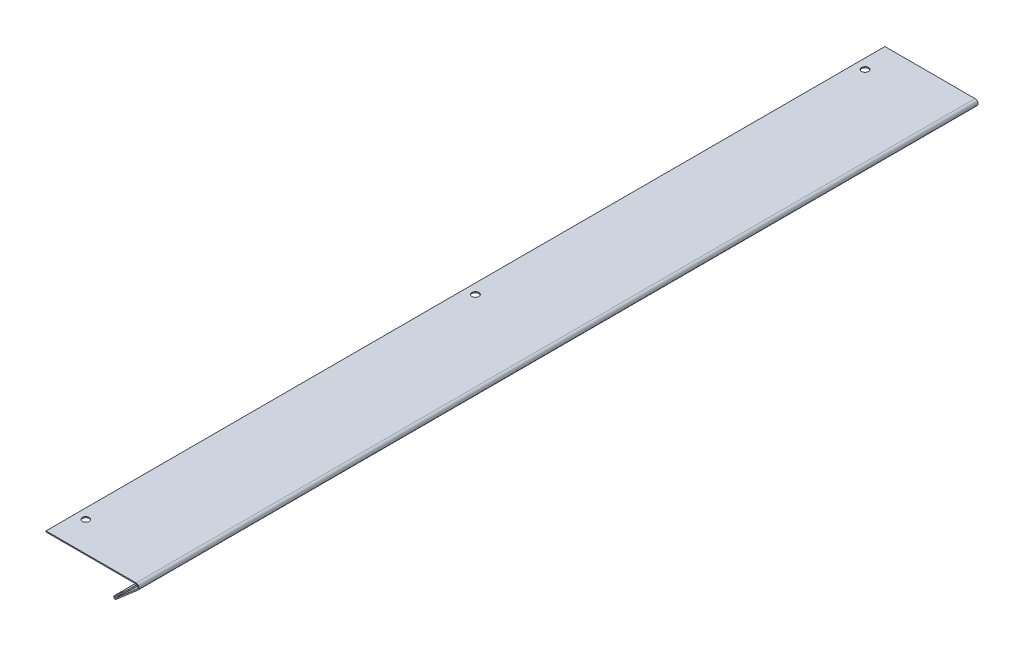
ISO-10303-21;
HEADER;
FILE_DESCRIPTION(('STEP AP214'),'2;1');
FILE_NAME('part.step','',(''),(''),'','','');
FILE_SCHEMA(('AUTOMOTIVE_DESIGN { 1 0 10303 214 1 1 1 1 }'));
ENDSEC;
DATA;
#1=APPLICATION_CONTEXT('core data for automotive mechanical design processes');
#2=APPLICATION_PROTOCOL_DEFINITION('international standard','automotive_design',2000,#1);
#3=PRODUCT_CONTEXT('',#1,'mechanical');
#4=PRODUCT('Part','Part','',(#3));
#5=PRODUCT_RELATED_PRODUCT_CATEGORY('part','',(#4));
#6=PRODUCT_DEFINITION_FORMATION('','',#4);
#7=PRODUCT_DEFINITION_CONTEXT('part definition',#1,'design');
#8=PRODUCT_DEFINITION('design','',#6,#7);
#9=PRODUCT_DEFINITION_SHAPE('','',#8);
#10=(LENGTH_UNIT() NAMED_UNIT(*) SI_UNIT(.MILLI.,.METRE.));
#11=(NAMED_UNIT(*) PLANE_ANGLE_UNIT() SI_UNIT($,.RADIAN.));
#12=(NAMED_UNIT(*) SI_UNIT($,.STERADIAN.) SOLID_ANGLE_UNIT());
#13=UNCERTAINTY_MEASURE_WITH_UNIT(LENGTH_MEASURE(1.E-05),#10,'distance_accuracy_value','');
#14=(GEOMETRIC_REPRESENTATION_CONTEXT(3) GLOBAL_UNCERTAINTY_ASSIGNED_CONTEXT((#13)) GLOBAL_UNIT_ASSIGNED_CONTEXT((#10,
#11,#12)) REPRESENTATION_CONTEXT('',''));
#15=CARTESIAN_POINT('',(0.,0.,0.));
#16=DIRECTION('',(0.,0.,1.));
#17=DIRECTION('',(1.,0.,0.));
#18=AXIS2_PLACEMENT_3D('',#15,#16,#17);
#19=CARTESIAN_POINT('',(48.3280295144953,-0.877354790111383,211.));
#20=DIRECTION('',(0.,0.,1.));
#21=DIRECTION('',(1.,0.,0.));
#22=AXIS2_PLACEMENT_3D('',#19,#20,#21);
#23=PLANE('',#22);
#24=DIRECTION('',(0.754709580222771,0.656059028990508,0.));
#25=VECTOR('',#24,1.);
#26=CARTESIAN_POINT('',(48.,-0.499999999999997,211.));
#27=LINE('',#26,#25);
#28=CARTESIAN_POINT('',(34.9812597411572,-11.8170182500863,211.));
#29=VERTEX_POINT('',#28);
#30=CARTESIAN_POINT('',(45.9814375350637,-2.25470958022269,211.));
#31=VERTEX_POINT('',#30);
#32=EDGE_CURVE('E139',#29,#31,#27,.T.);
#33=ORIENTED_EDGE('',*,*,#32,.F.);
#34=DIRECTION('',(0.656059028990517,-0.754709580222763,0.));
#35=VECTOR('',#34,1.);
#36=CARTESIAN_POINT('',(34.9812597411572,-11.8170182500863,211.));
#37=LINE('',#36,#35);
#38=CARTESIAN_POINT('',(35.3092892556525,-12.1943730401976,211.));
#39=VERTEX_POINT('',#38);
#40=EDGE_CURVE('E199',#29,#39,#37,.T.);
#41=ORIENTED_EDGE('',*,*,#40,.T.);
#42=DIRECTION('',(0.754709580222771,0.656059028990508,0.));
#43=VECTOR('',#42,1.);
#44=CARTESIAN_POINT('',(48.3280295144953,-0.877354790111383,211.));
#45=LINE('',#44,#43);
#46=CARTESIAN_POINT('',(46.3094670495589,-2.63206437033415,211.));
#47=VERTEX_POINT('',#46);
#48=EDGE_CURVE('E125',#39,#47,#45,.T.);
#49=ORIENTED_EDGE('',*,*,#48,.T.);
#50=DIRECTION('',(0.656059028990508,-0.754709580222771,0.));
#51=VECTOR('',#50,1.);
#52=CARTESIAN_POINT('',(45.9814375350637,-2.25470958022276,211.));
#53=LINE('',#52,#51);
#54=EDGE_CURVE('E153',#31,#47,#53,.T.);
#55=ORIENTED_EDGE('',*,*,#54,.F.);
#56=EDGE_LOOP('',(#33,#41,#49,#55));
#57=FACE_BOUND('',#56,.T.);
#58=ADVANCED_FACE('F36',(#57),#23,.T.);
#59=CARTESIAN_POINT('',(0.,-0.5,211.));
#60=DIRECTION('',(0.,1.,0.));
#61=DIRECTION('',(0.,0.,1.));
#62=AXIS2_PLACEMENT_3D('',#59,#60,#61);
#63=PLANE('',#62);
#64=CARTESIAN_POINT('',(5.,-0.5,196.));
#65=DIRECTION('',(0.,1.,0.));
#66=DIRECTION('',(0.,0.,1.));
#67=AXIS2_PLACEMENT_3D('',#64,#65,#66);
#68=CIRCLE('',#67,1.75);
#69=CARTESIAN_POINT('',(5.,-0.5,197.75));
#70=VERTEX_POINT('',#69);
#71=EDGE_CURVE('E102',#70,#70,#68,.T.);
#72=ORIENTED_EDGE('',*,*,#71,.T.);
#73=EDGE_LOOP('',(#72));
#74=FACE_BOUND('',#73,.T.);
#75=CARTESIAN_POINT('',(5.,-0.5,0.));
#76=DIRECTION('',(0.,1.,0.));
#77=DIRECTION('',(0.,0.,1.));
#78=AXIS2_PLACEMENT_3D('',#75,#76,#77);
#79=CIRCLE('',#78,1.75);
#80=CARTESIAN_POINT('',(5.,-0.5,1.75));
#81=VERTEX_POINT('',#80);
#82=EDGE_CURVE('E108',#81,#81,#79,.T.);
#83=ORIENTED_EDGE('',*,*,#82,.T.);
#84=EDGE_LOOP('',(#83));
#85=FACE_BOUND('',#84,.T.);
#86=CARTESIAN_POINT('',(5.,-0.5,-196.));
#87=DIRECTION('',(0.,1.,0.));
#88=DIRECTION('',(0.,0.,1.));
#89=AXIS2_PLACEMENT_3D('',#86,#87,#88);
#90=CIRCLE('',#89,1.75);
#91=CARTESIAN_POINT('',(5.,-0.5,-194.25));
#92=VERTEX_POINT('',#91);
#93=EDGE_CURVE('E87',#92,#92,#90,.T.);
#94=ORIENTED_EDGE('',*,*,#93,.T.);
#95=EDGE_LOOP('',(#94));
#96=FACE_BOUND('',#95,.T.);
#97=DIRECTION('',(0.,0.,1.));
#98=VECTOR('',#97,1.);
#99=CARTESIAN_POINT('',(45.3253785060732,-0.499999999999979,211.));
#100=LINE('',#99,#98);
#101=CARTESIAN_POINT('',(45.3253785060732,-0.499999999999979,211.));
#102=VERTEX_POINT('',#101);
#103=CARTESIAN_POINT('',(45.3253785060732,-0.500000000000067,-211.));
#104=VERTEX_POINT('',#103);
#105=EDGE_CURVE('E124',#102,#104,#100,.F.);
#106=ORIENTED_EDGE('',*,*,#105,.F.);
#107=DIRECTION('',(1.,0.,0.));
#108=VECTOR('',#107,1.);
#109=CARTESIAN_POINT('',(0.,-0.5,211.));
#110=LINE('',#109,#108);
#111=CARTESIAN_POINT('',(0.,-0.5,211.));
#112=VERTEX_POINT('',#111);
#113=EDGE_CURVE('E75',#112,#102,#110,.T.);
#114=ORIENTED_EDGE('',*,*,#113,.F.);
#115=DIRECTION('',(0.,0.,-1.));
#116=VECTOR('',#115,1.);
#117=CARTESIAN_POINT('',(0.,-0.5,211.));
#118=LINE('',#117,#116);
#119=CARTESIAN_POINT('',(0.,-0.5,-211.));
#120=VERTEX_POINT('',#119);
#121=EDGE_CURVE('E44',#112,#120,#118,.T.);
#122=ORIENTED_EDGE('',*,*,#121,.T.);
#123=DIRECTION('',(1.,0.,0.));
#124=VECTOR('',#123,1.);
#125=CARTESIAN_POINT('',(0.,-0.5,-211.));
#126=LINE('',#125,#124);
#127=EDGE_CURVE('E73',#120,#104,#126,.T.);
#128=ORIENTED_EDGE('',*,*,#127,.T.);
#129=EDGE_LOOP('',(#106,#114,#122,#128));
#130=FACE_BOUND('',#129,.T.);
#131=ADVANCED_FACE('F38',(#74,#85,#96,#130),#63,.F.);
#132=CARTESIAN_POINT('',(0.,0.,211.));
#133=DIRECTION('',(0.,1.,0.));
#134=DIRECTION('',(0.,0.,1.));
#135=AXIS2_PLACEMENT_3D('',#132,#133,#134);
#136=PLANE('',#135);
#137=CARTESIAN_POINT('',(5.,0.,-196.));
#138=DIRECTION('',(0.,1.,0.));
#139=DIRECTION('',(0.,0.,1.));
#140=AXIS2_PLACEMENT_3D('',#137,#138,#139);
#141=CIRCLE('',#140,1.75);
#142=CARTESIAN_POINT('',(5.,0.,-194.25));
#143=VERTEX_POINT('',#142);
#144=EDGE_CURVE('E111',#143,#143,#141,.T.);
#145=ORIENTED_EDGE('',*,*,#144,.F.);
#146=EDGE_LOOP('',(#145));
#147=FACE_BOUND('',#146,.T.);
#148=CARTESIAN_POINT('',(5.,0.,0.));
#149=DIRECTION('',(0.,1.,0.));
#150=DIRECTION('',(0.,0.,1.));
#151=AXIS2_PLACEMENT_3D('',#148,#149,#150);
#152=CIRCLE('',#151,1.75);
#153=CARTESIAN_POINT('',(5.,0.,1.75));
#154=VERTEX_POINT('',#153);
#155=EDGE_CURVE('E105',#154,#154,#152,.T.);
#156=ORIENTED_EDGE('',*,*,#155,.F.);
#157=EDGE_LOOP('',(#156));
#158=FACE_BOUND('',#157,.T.);
#159=CARTESIAN_POINT('',(5.,0.,196.));
#160=DIRECTION('',(0.,1.,0.));
#161=DIRECTION('',(0.,0.,1.));
#162=AXIS2_PLACEMENT_3D('',#159,#160,#161);
#163=CIRCLE('',#162,1.75);
#164=CARTESIAN_POINT('',(5.,0.,197.75));
#165=VERTEX_POINT('',#164);
#166=EDGE_CURVE('E99',#165,#165,#163,.T.);
#167=ORIENTED_EDGE('',*,*,#166,.F.);
#168=EDGE_LOOP('',(#167));
#169=FACE_BOUND('',#168,.T.);
#170=DIRECTION('',(1.,0.,0.));
#171=VECTOR('',#170,1.);
#172=CARTESIAN_POINT('',(0.,0.,211.));
#173=LINE('',#172,#171);
#174=CARTESIAN_POINT('',(0.,0.,211.));
#175=VERTEX_POINT('',#174);
#176=CARTESIAN_POINT('',(45.3253785060732,0.,211.));
#177=VERTEX_POINT('',#176);
#178=EDGE_CURVE('E92',#175,#177,#173,.T.);
#179=ORIENTED_EDGE('',*,*,#178,.T.);
#180=DIRECTION('',(0.,0.,1.));
#181=VECTOR('',#180,1.);
#182=CARTESIAN_POINT('',(45.3253785060732,0.,211.));
#183=LINE('',#182,#181);
#184=CARTESIAN_POINT('',(45.3253785060732,0.,-211.));
#185=VERTEX_POINT('',#184);
#186=EDGE_CURVE('E134',#177,#185,#183,.F.);
#187=ORIENTED_EDGE('',*,*,#186,.T.);
#188=DIRECTION('',(1.,0.,0.));
#189=VECTOR('',#188,1.);
#190=CARTESIAN_POINT('',(0.,0.,-211.));
#191=LINE('',#190,#189);
#192=CARTESIAN_POINT('',(0.,0.,-211.));
#193=VERTEX_POINT('',#192);
#194=EDGE_CURVE('E86',#193,#185,#191,.T.);
#195=ORIENTED_EDGE('',*,*,#194,.F.);
#196=DIRECTION('',(0.,0.,-1.));
#197=VECTOR('',#196,1.);
#198=CARTESIAN_POINT('',(0.,0.,211.));
#199=LINE('',#198,#197);
#200=EDGE_CURVE('E11',#175,#193,#199,.T.);
#201=ORIENTED_EDGE('',*,*,#200,.F.);
#202=EDGE_LOOP('',(#179,#187,#195,#201));
#203=FACE_BOUND('',#202,.T.);
#204=ADVANCED_FACE('F271',(#147,#158,#169,#203),#136,.T.);
#205=CARTESIAN_POINT('',(0.,0.,211.));
#206=DIRECTION('',(0.,0.,-1.));
#207=DIRECTION('',(-1.,0.,0.));
#208=AXIS2_PLACEMENT_3D('',#205,#206,#207);
#209=PLANE('',#208);
#210=DIRECTION('',(0.,1.,0.));
#211=VECTOR('',#210,1.);
#212=CARTESIAN_POINT('',(45.3253785060732,-0.499999999999979,211.));
#213=LINE('',#212,#211);
#214=EDGE_CURVE('E116',#102,#177,#213,.T.);
#215=ORIENTED_EDGE('',*,*,#214,.T.);
#216=ORIENTED_EDGE('',*,*,#178,.F.);
#217=DIRECTION('',(0.,1.,0.));
#218=VECTOR('',#217,1.);
#219=CARTESIAN_POINT('',(0.,-0.5,211.));
#220=LINE('',#219,#218);
#221=EDGE_CURVE('E77',#112,#175,#220,.T.);
#222=ORIENTED_EDGE('',*,*,#221,.F.);
#223=ORIENTED_EDGE('',*,*,#113,.T.);
#224=EDGE_LOOP('',(#215,#216,#222,#223));
#225=FACE_BOUND('',#224,.T.);
#226=ADVANCED_FACE('F359',(#225),#209,.F.);
#227=CARTESIAN_POINT('',(0.,-0.5,211.));
#228=DIRECTION('',(-1.,0.,0.));
#229=DIRECTION('',(0.,0.,1.));
#230=AXIS2_PLACEMENT_3D('',#227,#228,#229);
#231=PLANE('',#230);
#232=DIRECTION('',(0.,1.,0.));
#233=VECTOR('',#232,1.);
#234=CARTESIAN_POINT('',(0.,-0.5,-211.));
#235=LINE('',#234,#233);
#236=EDGE_CURVE('E83',#120,#193,#235,.T.);
#237=ORIENTED_EDGE('',*,*,#236,.F.);
#238=ORIENTED_EDGE('',*,*,#121,.F.);
#239=ORIENTED_EDGE('',*,*,#221,.T.);
#240=ORIENTED_EDGE('',*,*,#200,.T.);
#241=EDGE_LOOP('',(#237,#238,#239,#240));
#242=FACE_BOUND('',#241,.T.);
#243=ADVANCED_FACE('F89',(#242),#231,.T.);
#244=CARTESIAN_POINT('',(0.,0.,-211.));
#245=DIRECTION('',(0.,0.,-1.));
#246=DIRECTION('',(-1.,0.,0.));
#247=AXIS2_PLACEMENT_3D('',#244,#245,#246);
#248=PLANE('',#247);
#249=DIRECTION('',(0.,1.,0.));
#250=VECTOR('',#249,1.);
#251=CARTESIAN_POINT('',(45.3253785060732,-0.500000000000067,-211.));
#252=LINE('',#251,#250);
#253=EDGE_CURVE('E85',#104,#185,#252,.T.);
#254=ORIENTED_EDGE('',*,*,#253,.F.);
#255=ORIENTED_EDGE('',*,*,#127,.F.);
#256=ORIENTED_EDGE('',*,*,#236,.T.);
#257=ORIENTED_EDGE('',*,*,#194,.T.);
#258=EDGE_LOOP('',(#254,#255,#256,#257));
#259=FACE_BOUND('',#258,.T.);
#260=ADVANCED_FACE('F81',(#259),#248,.T.);
#261=CARTESIAN_POINT('',(5.,-0.5,196.));
#262=DIRECTION('',(0.,1.,0.));
#263=DIRECTION('',(0.,0.,1.));
#264=AXIS2_PLACEMENT_3D('',#261,#262,#263);
#265=CYLINDRICAL_SURFACE('',#264,1.75);
#266=ORIENTED_EDGE('',*,*,#71,.F.);
#267=EDGE_LOOP('',(#266));
#268=FACE_BOUND('',#267,.T.);
#269=ORIENTED_EDGE('',*,*,#166,.T.);
#270=EDGE_LOOP('',(#269));
#271=FACE_BOUND('',#270,.T.);
#272=ADVANCED_FACE('F354',(#268,#271),#265,.F.);
#273=CARTESIAN_POINT('',(5.,-0.5,0.));
#274=DIRECTION('',(0.,1.,0.));
#275=DIRECTION('',(0.,0.,1.));
#276=AXIS2_PLACEMENT_3D('',#273,#274,#275);
#277=CYLINDRICAL_SURFACE('',#276,1.75);
#278=ORIENTED_EDGE('',*,*,#82,.F.);
#279=EDGE_LOOP('',(#278));
#280=FACE_BOUND('',#279,.T.);
#281=ORIENTED_EDGE('',*,*,#155,.T.);
#282=EDGE_LOOP('',(#281));
#283=FACE_BOUND('',#282,.T.);
#284=ADVANCED_FACE('F350',(#280,#283),#277,.F.);
#285=CARTESIAN_POINT('',(5.,-0.5,-196.));
#286=DIRECTION('',(0.,1.,0.));
#287=DIRECTION('',(0.,0.,1.));
#288=AXIS2_PLACEMENT_3D('',#285,#286,#287);
#289=CYLINDRICAL_SURFACE('',#288,1.75);
#290=ORIENTED_EDGE('',*,*,#93,.F.);
#291=EDGE_LOOP('',(#290));
#292=FACE_BOUND('',#291,.T.);
#293=ORIENTED_EDGE('',*,*,#144,.T.);
#294=EDGE_LOOP('',(#293));
#295=FACE_BOUND('',#294,.T.);
#296=ADVANCED_FACE('F345',(#292,#295),#289,.F.);
#297=CARTESIAN_POINT('',(45.3253785060732,-1.50000000000003,-211.));
#298=DIRECTION('',(0.,0.,-1.));
#299=DIRECTION('',(0.,1.,0.));
#300=AXIS2_PLACEMENT_3D('',#297,#298,#299);
#301=PLANE('',#300);
#302=DIRECTION('',(0.656059028990508,-0.754709580222771,0.));
#303=VECTOR('',#302,1.);
#304=CARTESIAN_POINT('',(45.9814375350637,-2.25470958022277,-211.));
#305=LINE('',#304,#303);
#306=CARTESIAN_POINT('',(45.9814375350637,-2.25470958022278,-211.));
#307=VERTEX_POINT('',#306);
#308=CARTESIAN_POINT('',(46.3094670495589,-2.63206437033417,-211.));
#309=VERTEX_POINT('',#308);
#310=EDGE_CURVE('E154',#307,#309,#305,.T.);
#311=ORIENTED_EDGE('',*,*,#310,.F.);
#312=CARTESIAN_POINT('',(45.3253785060732,-1.50000000000003,-211.));
#313=DIRECTION('',(0.,0.,1.));
#314=DIRECTION('',(0.,-1.,0.));
#315=AXIS2_PLACEMENT_3D('',#312,#313,#314);
#316=CIRCLE('',#315,0.999999999999967);
#317=EDGE_CURVE('E128',#104,#307,#316,.F.);
#318=ORIENTED_EDGE('',*,*,#317,.F.);
#319=ORIENTED_EDGE('',*,*,#253,.T.);
#320=CARTESIAN_POINT('',(45.3253785060732,-1.50000000000003,-211.));
#321=DIRECTION('',(0.,0.,1.));
#322=DIRECTION('',(0.,-1.,0.));
#323=AXIS2_PLACEMENT_3D('',#320,#321,#322);
#324=CIRCLE('',#323,1.49999999999997);
#325=EDGE_CURVE('E119',#185,#309,#324,.F.);
#326=ORIENTED_EDGE('',*,*,#325,.T.);
#327=EDGE_LOOP('',(#311,#318,#319,#326));
#328=FACE_BOUND('',#327,.T.);
#329=ADVANCED_FACE('F243',(#328),#301,.T.);
#330=CARTESIAN_POINT('',(45.3253785060732,-1.49999999999995,211.));
#331=DIRECTION('',(0.,0.,-1.));
#332=DIRECTION('',(0.,1.,0.));
#333=AXIS2_PLACEMENT_3D('',#330,#331,#332);
#334=PLANE('',#333);
#335=CARTESIAN_POINT('',(45.3253785060732,-1.49999999999995,211.));
#336=DIRECTION('',(0.,0.,1.));
#337=DIRECTION('',(0.,-1.,0.));
#338=AXIS2_PLACEMENT_3D('',#335,#336,#337);
#339=CIRCLE('',#338,0.999999999999967);
#340=EDGE_CURVE('E121',#31,#102,#339,.T.);
#341=ORIENTED_EDGE('',*,*,#340,.F.);
#342=ORIENTED_EDGE('',*,*,#54,.T.);
#343=CARTESIAN_POINT('',(45.3253785060732,-1.49999999999995,211.));
#344=DIRECTION('',(0.,0.,1.));
#345=DIRECTION('',(0.,-1.,0.));
#346=AXIS2_PLACEMENT_3D('',#343,#344,#345);
#347=CIRCLE('',#346,1.49999999999997);
#348=EDGE_CURVE('E131',#47,#177,#347,.T.);
#349=ORIENTED_EDGE('',*,*,#348,.T.);
#350=ORIENTED_EDGE('',*,*,#214,.F.);
#351=EDGE_LOOP('',(#341,#342,#349,#350));
#352=FACE_BOUND('',#351,.T.);
#353=ADVANCED_FACE('F262',(#352),#334,.F.);
#354=CARTESIAN_POINT('',(45.3253785060732,-1.49999999999995,211.));
#355=DIRECTION('',(0.,0.,1.));
#356=DIRECTION('',(0.656059028990508,-0.754709580222771,0.));
#357=AXIS2_PLACEMENT_3D('',#354,#355,#356);
#358=CYLINDRICAL_SURFACE('',#357,1.49999999999997);
#359=ORIENTED_EDGE('',*,*,#186,.F.);
#360=ORIENTED_EDGE('',*,*,#348,.F.);
#361=DIRECTION('',(0.,0.,1.));
#362=VECTOR('',#361,1.);
#363=CARTESIAN_POINT('',(46.3094670495589,-2.63206437033415,0.));
#364=LINE('',#363,#362);
#365=EDGE_CURVE('E146',#309,#47,#364,.T.);
#366=ORIENTED_EDGE('',*,*,#365,.F.);
#367=ORIENTED_EDGE('',*,*,#325,.F.);
#368=EDGE_LOOP('',(#359,#360,#366,#367));
#369=FACE_BOUND('',#368,.T.);
#370=ADVANCED_FACE('F268',(#369),#358,.T.);
#371=CARTESIAN_POINT('',(45.3253785060732,-1.49999999999995,211.));
#372=DIRECTION('',(0.,0.,1.));
#373=DIRECTION('',(0.656059028990508,-0.754709580222771,0.));
#374=AXIS2_PLACEMENT_3D('',#371,#372,#373);
#375=CYLINDRICAL_SURFACE('',#374,0.999999999999967);
#376=ORIENTED_EDGE('',*,*,#105,.T.);
#377=ORIENTED_EDGE('',*,*,#317,.T.);
#378=DIRECTION('',(0.,0.,1.));
#379=VECTOR('',#378,1.);
#380=CARTESIAN_POINT('',(45.9814375350637,-2.25470958022277,-211.));
#381=LINE('',#380,#379);
#382=EDGE_CURVE('E157',#307,#31,#381,.T.);
#383=ORIENTED_EDGE('',*,*,#382,.T.);
#384=ORIENTED_EDGE('',*,*,#340,.T.);
#385=EDGE_LOOP('',(#376,#377,#383,#384));
#386=FACE_BOUND('',#385,.T.);
#387=ADVANCED_FACE('F250',(#386),#375,.F.);
#388=CARTESIAN_POINT('',(34.7432570704854,-12.6864173119405,-211.));
#389=DIRECTION('',(0.,0.,-1.));
#390=DIRECTION('',(-1.,0.,0.));
#391=AXIS2_PLACEMENT_3D('',#388,#389,#390);
#392=PLANE('',#391);
#393=DIRECTION('',(0.656059028990517,-0.754709580222763,0.));
#394=VECTOR('',#393,1.);
#395=CARTESIAN_POINT('',(34.9812597411572,-11.8170182500863,-211.));
#396=LINE('',#395,#394);
#397=CARTESIAN_POINT('',(34.9812597411572,-11.8170182500863,-211.));
#398=VERTEX_POINT('',#397);
#399=CARTESIAN_POINT('',(35.3092892556525,-12.1943730401976,-211.));
#400=VERTEX_POINT('',#399);
#401=EDGE_CURVE('E179',#398,#400,#396,.T.);
#402=ORIENTED_EDGE('',*,*,#401,.F.);
#403=DIRECTION('',(-0.754709580222771,-0.656059028990508,0.));
#404=VECTOR('',#403,1.);
#405=CARTESIAN_POINT('',(34.4152275559901,-12.3090625218291,-211.));
#406=LINE('',#405,#404);
#407=EDGE_CURVE('E143',#307,#398,#406,.T.);
#408=ORIENTED_EDGE('',*,*,#407,.F.);
#409=ORIENTED_EDGE('',*,*,#310,.T.);
#410=DIRECTION('',(-0.754709580222771,-0.656059028990508,0.));
#411=VECTOR('',#410,1.);
#412=CARTESIAN_POINT('',(34.7432570704854,-12.6864173119405,-211.));
#413=LINE('',#412,#411);
#414=EDGE_CURVE('E142',#309,#400,#413,.T.);
#415=ORIENTED_EDGE('',*,*,#414,.T.);
#416=EDGE_LOOP('',(#402,#408,#409,#415));
#417=FACE_BOUND('',#416,.T.);
#418=ADVANCED_FACE('F233',(#417),#392,.T.);
#419=CARTESIAN_POINT('',(21.2354421086391,-24.4285817151491,0.));
#420=DIRECTION('',(0.656059028990508,-0.754709580222771,0.));
#421=DIRECTION('',(0.754709580222771,0.656059028990508,0.));
#422=AXIS2_PLACEMENT_3D('',#419,#420,#421);
#423=PLANE('',#422);
#424=DIRECTION('',(0.,0.,1.));
#425=VECTOR('',#424,1.);
#426=CARTESIAN_POINT('',(35.3092892556525,-12.1943730401976,211.));
#427=LINE('',#426,#425);
#428=EDGE_CURVE('E214',#39,#400,#427,.F.);
#429=ORIENTED_EDGE('',*,*,#428,.T.);
#430=ORIENTED_EDGE('',*,*,#414,.F.);
#431=ORIENTED_EDGE('',*,*,#365,.T.);
#432=ORIENTED_EDGE('',*,*,#48,.F.);
#433=EDGE_LOOP('',(#429,#430,#431,#432));
#434=FACE_BOUND('',#433,.T.);
#435=ADVANCED_FACE('F223',(#434),#423,.T.);
#436=CARTESIAN_POINT('',(20.9074125941439,-24.0512269250377,0.));
#437=DIRECTION('',(0.656059028990508,-0.754709580222771,0.));
#438=DIRECTION('',(0.754709580222771,0.656059028990508,0.));
#439=AXIS2_PLACEMENT_3D('',#436,#437,#438);
#440=PLANE('',#439);
#441=ORIENTED_EDGE('',*,*,#407,.T.);
#442=DIRECTION('',(0.,0.,1.));
#443=VECTOR('',#442,1.);
#444=CARTESIAN_POINT('',(34.9812597411572,-11.8170182500863,211.));
#445=LINE('',#444,#443);
#446=EDGE_CURVE('E206',#29,#398,#445,.F.);
#447=ORIENTED_EDGE('',*,*,#446,.F.);
#448=ORIENTED_EDGE('',*,*,#32,.T.);
#449=ORIENTED_EDGE('',*,*,#382,.F.);
#450=EDGE_LOOP('',(#441,#447,#448,#449));
#451=FACE_BOUND('',#450,.T.);
#452=ADVANCED_FACE('F253',(#451),#440,.F.);
#453=CARTESIAN_POINT('',(37.815732520697,-8.0280356607824,211.));
#454=DIRECTION('',(0.,0.,-1.));
#455=DIRECTION('',(-0.754709580222771,-0.656059028990508,0.));
#456=AXIS2_PLACEMENT_3D('',#453,#454,#455);
#457=PLANE('',#456);
#458=DIRECTION('',(-0.656059028990508,0.754709580222771,0.));
#459=VECTOR('',#458,1.);
#460=CARTESIAN_POINT('',(34.3252007121667,-11.0623086698635,211.));
#461=LINE('',#460,#459);
#462=CARTESIAN_POINT('',(34.6532302266619,-11.4396634599749,211.));
#463=VERTEX_POINT('',#462);
#464=CARTESIAN_POINT('',(34.3252007121667,-11.0623086698635,211.));
#465=VERTEX_POINT('',#464);
#466=EDGE_CURVE('E170',#463,#465,#461,.T.);
#467=ORIENTED_EDGE('',*,*,#466,.F.);
#468=DIRECTION('',(-0.754709580222771,-0.656059028990508,0.));
#469=VECTOR('',#468,1.);
#470=CARTESIAN_POINT('',(38.1437620351923,-8.40539045089378,211.));
#471=LINE('',#470,#469);
#472=CARTESIAN_POINT('',(41.6342938437226,-5.37111744181268,211.));
#473=VERTEX_POINT('',#472);
#474=EDGE_CURVE('E182',#473,#463,#471,.T.);
#475=ORIENTED_EDGE('',*,*,#474,.F.);
#476=DIRECTION('',(-0.656059028990508,0.754709580222771,0.));
#477=VECTOR('',#476,1.);
#478=CARTESIAN_POINT('',(41.3062643292273,-4.9937626517013,211.));
#479=LINE('',#478,#477);
#480=CARTESIAN_POINT('',(41.3062643292273,-4.9937626517013,211.));
#481=VERTEX_POINT('',#480);
#482=EDGE_CURVE('E166',#473,#481,#479,.T.);
#483=ORIENTED_EDGE('',*,*,#482,.T.);
#484=DIRECTION('',(-0.754709580222771,-0.656059028990508,0.));
#485=VECTOR('',#484,1.);
#486=CARTESIAN_POINT('',(37.815732520697,-8.0280356607824,211.));
#487=LINE('',#486,#485);
#488=EDGE_CURVE('E194',#481,#465,#487,.T.);
#489=ORIENTED_EDGE('',*,*,#488,.T.);
#490=EDGE_LOOP('',(#467,#475,#483,#489));
#491=FACE_BOUND('',#490,.T.);
#492=ADVANCED_FACE('F314',(#491),#457,.F.);
#493=CARTESIAN_POINT('',(41.3062643292273,-4.9937626517013,0.));
#494=DIRECTION('',(-0.754709580222771,-0.656059028990508,0.));
#495=DIRECTION('',(0.,0.,1.));
#496=AXIS2_PLACEMENT_3D('',#493,#494,#495);
#497=PLANE('',#496);
#498=ORIENTED_EDGE('',*,*,#482,.F.);
#499=DIRECTION('',(0.,0.,1.));
#500=VECTOR('',#499,1.);
#501=CARTESIAN_POINT('',(41.6342938437226,-5.37111744181268,0.));
#502=LINE('',#501,#500);
#503=CARTESIAN_POINT('',(41.6342938437226,-5.37111744181268,-211.));
#504=VERTEX_POINT('',#503);
#505=EDGE_CURVE('E185',#504,#473,#502,.T.);
#506=ORIENTED_EDGE('',*,*,#505,.F.);
#507=DIRECTION('',(-0.656059028990508,0.754709580222771,0.));
#508=VECTOR('',#507,1.);
#509=CARTESIAN_POINT('',(41.3062643292273,-4.9937626517013,-211.));
#510=LINE('',#509,#508);
#511=CARTESIAN_POINT('',(41.3062643292273,-4.9937626517013,-211.));
#512=VERTEX_POINT('',#511);
#513=EDGE_CURVE('E163',#504,#512,#510,.T.);
#514=ORIENTED_EDGE('',*,*,#513,.T.);
#515=DIRECTION('',(0.,0.,1.));
#516=VECTOR('',#515,1.);
#517=CARTESIAN_POINT('',(41.3062643292273,-4.9937626517013,0.));
#518=LINE('',#517,#516);
#519=EDGE_CURVE('E167',#512,#481,#518,.T.);
#520=ORIENTED_EDGE('',*,*,#519,.T.);
#521=EDGE_LOOP('',(#498,#506,#514,#520));
#522=FACE_BOUND('',#521,.T.);
#523=ADVANCED_FACE('F318',(#522),#497,.F.);
#524=CARTESIAN_POINT('',(37.815732520697,-8.0280356607824,-211.));
#525=DIRECTION('',(0.,0.,1.));
#526=DIRECTION('',(0.754709580222771,0.656059028990508,0.));
#527=AXIS2_PLACEMENT_3D('',#524,#525,#526);
#528=PLANE('',#527);
#529=DIRECTION('',(-0.754709580222771,-0.656059028990508,0.));
#530=VECTOR('',#529,1.);
#531=CARTESIAN_POINT('',(38.1437620351923,-8.40539045089378,-211.));
#532=LINE('',#531,#530);
#533=CARTESIAN_POINT('',(34.6532302266619,-11.4396634599749,-211.));
#534=VERTEX_POINT('',#533);
#535=EDGE_CURVE('E175',#534,#504,#532,.F.);
#536=ORIENTED_EDGE('',*,*,#535,.F.);
#537=DIRECTION('',(-0.656059028990508,0.754709580222771,0.));
#538=VECTOR('',#537,1.);
#539=CARTESIAN_POINT('',(34.3252007121667,-11.0623086698635,-211.));
#540=LINE('',#539,#538);
#541=CARTESIAN_POINT('',(34.3252007121667,-11.0623086698635,-211.));
#542=VERTEX_POINT('',#541);
#543=EDGE_CURVE('E158',#534,#542,#540,.T.);
#544=ORIENTED_EDGE('',*,*,#543,.T.);
#545=DIRECTION('',(0.754709580222771,0.656059028990508,0.));
#546=VECTOR('',#545,1.);
#547=CARTESIAN_POINT('',(37.815732520697,-8.0280356607824,-211.));
#548=LINE('',#547,#546);
#549=EDGE_CURVE('E188',#542,#512,#548,.T.);
#550=ORIENTED_EDGE('',*,*,#549,.T.);
#551=ORIENTED_EDGE('',*,*,#513,.F.);
#552=EDGE_LOOP('',(#536,#544,#550,#551));
#553=FACE_BOUND('',#552,.T.);
#554=ADVANCED_FACE('F303',(#553),#528,.F.);
#555=CARTESIAN_POINT('',(37.815732520697,-8.0280356607824,0.));
#556=DIRECTION('',(-0.656059028990508,0.754709580222771,0.));
#557=DIRECTION('',(-0.754709580222771,-0.656059028990508,0.));
#558=AXIS2_PLACEMENT_3D('',#555,#556,#557);
#559=PLANE('',#558);
#560=ORIENTED_EDGE('',*,*,#519,.F.);
#561=ORIENTED_EDGE('',*,*,#549,.F.);
#562=DIRECTION('',(0.,0.,-1.));
#563=VECTOR('',#562,1.);
#564=CARTESIAN_POINT('',(34.3252007121667,-11.0623086698635,0.));
#565=LINE('',#564,#563);
#566=EDGE_CURVE('E191',#465,#542,#565,.T.);
#567=ORIENTED_EDGE('',*,*,#566,.F.);
#568=ORIENTED_EDGE('',*,*,#488,.F.);
#569=EDGE_LOOP('',(#560,#561,#567,#568));
#570=FACE_BOUND('',#569,.T.);
#571=ADVANCED_FACE('F298',(#570),#559,.T.);
#572=CARTESIAN_POINT('',(38.1437620351923,-8.40539045089378,0.));
#573=DIRECTION('',(-0.656059028990508,0.754709580222771,0.));
#574=DIRECTION('',(-0.754709580222771,-0.656059028990508,0.));
#575=AXIS2_PLACEMENT_3D('',#572,#573,#574);
#576=PLANE('',#575);
#577=ORIENTED_EDGE('',*,*,#505,.T.);
#578=ORIENTED_EDGE('',*,*,#474,.T.);
#579=DIRECTION('',(0.,0.,1.));
#580=VECTOR('',#579,1.);
#581=CARTESIAN_POINT('',(34.6532302266619,-11.4396634599749,0.));
#582=LINE('',#581,#580);
#583=EDGE_CURVE('E178',#463,#534,#582,.F.);
#584=ORIENTED_EDGE('',*,*,#583,.T.);
#585=ORIENTED_EDGE('',*,*,#535,.T.);
#586=EDGE_LOOP('',(#577,#578,#584,#585));
#587=FACE_BOUND('',#586,.T.);
#588=ADVANCED_FACE('F315',(#587),#576,.F.);
#589=CARTESIAN_POINT('',(34.8172449839096,-11.6283408550306,-211.));
#590=DIRECTION('',(0.,0.,-1.));
#591=DIRECTION('',(-1.,0.,0.));
#592=AXIS2_PLACEMENT_3D('',#589,#590,#591);
#593=PLANE('',#592);
#594=ORIENTED_EDGE('',*,*,#543,.F.);
#595=CARTESIAN_POINT('',(34.8172449839096,-11.6283408550306,-211.));
#596=DIRECTION('',(0.,0.,1.));
#597=DIRECTION('',(1.,0.,0.));
#598=AXIS2_PLACEMENT_3D('',#595,#596,#597);
#599=CIRCLE('',#598,0.250000000000001);
#600=EDGE_CURVE('E208',#398,#534,#599,.F.);
#601=ORIENTED_EDGE('',*,*,#600,.F.);
#602=ORIENTED_EDGE('',*,*,#401,.T.);
#603=CARTESIAN_POINT('',(34.8172449839096,-11.6283408550306,-211.));
#604=DIRECTION('',(0.,0.,1.));
#605=DIRECTION('',(1.,0.,0.));
#606=AXIS2_PLACEMENT_3D('',#603,#604,#605);
#607=CIRCLE('',#606,0.750000000000001);
#608=EDGE_CURVE('E202',#400,#542,#607,.F.);
#609=ORIENTED_EDGE('',*,*,#608,.T.);
#610=EDGE_LOOP('',(#594,#601,#602,#609));
#611=FACE_BOUND('',#610,.T.);
#612=ADVANCED_FACE('F307',(#611),#593,.T.);
#613=CARTESIAN_POINT('',(34.8172449839096,-11.6283408550306,211.));
#614=DIRECTION('',(0.,0.,-1.));
#615=DIRECTION('',(-1.,0.,0.));
#616=AXIS2_PLACEMENT_3D('',#613,#614,#615);
#617=PLANE('',#616);
#618=CARTESIAN_POINT('',(34.8172449839096,-11.6283408550306,211.));
#619=DIRECTION('',(0.,0.,1.));
#620=DIRECTION('',(1.,0.,0.));
#621=AXIS2_PLACEMENT_3D('',#618,#619,#620);
#622=CIRCLE('',#621,0.250000000000001);
#623=EDGE_CURVE('E51',#463,#29,#622,.T.);
#624=ORIENTED_EDGE('',*,*,#623,.F.);
#625=ORIENTED_EDGE('',*,*,#466,.T.);
#626=CARTESIAN_POINT('',(34.8172449839096,-11.6283408550306,211.));
#627=DIRECTION('',(0.,0.,1.));
#628=DIRECTION('',(1.,0.,0.));
#629=AXIS2_PLACEMENT_3D('',#626,#627,#628);
#630=CIRCLE('',#629,0.750000000000001);
#631=EDGE_CURVE('E211',#465,#39,#630,.T.);
#632=ORIENTED_EDGE('',*,*,#631,.T.);
#633=ORIENTED_EDGE('',*,*,#40,.F.);
#634=EDGE_LOOP('',(#624,#625,#632,#633));
#635=FACE_BOUND('',#634,.T.);
#636=ADVANCED_FACE('F311',(#635),#617,.F.);
#637=CARTESIAN_POINT('',(34.8172449839096,-11.6283408550306,211.));
#638=DIRECTION('',(0.,0.,1.));
#639=DIRECTION('',(-0.656059028990508,0.754709580222771,0.));
#640=AXIS2_PLACEMENT_3D('',#637,#638,#639);
#641=CYLINDRICAL_SURFACE('',#640,0.750000000000001);
#642=ORIENTED_EDGE('',*,*,#428,.F.);
#643=ORIENTED_EDGE('',*,*,#631,.F.);
#644=ORIENTED_EDGE('',*,*,#566,.T.);
#645=ORIENTED_EDGE('',*,*,#608,.F.);
#646=EDGE_LOOP('',(#642,#643,#644,#645));
#647=FACE_BOUND('',#646,.T.);
#648=ADVANCED_FACE('F306',(#647),#641,.T.);
#649=CARTESIAN_POINT('',(34.8172449839096,-11.6283408550306,211.));
#650=DIRECTION('',(0.,0.,1.));
#651=DIRECTION('',(-0.656059028990508,0.754709580222771,0.));
#652=AXIS2_PLACEMENT_3D('',#649,#650,#651);
#653=CYLINDRICAL_SURFACE('',#652,0.250000000000001);
#654=ORIENTED_EDGE('',*,*,#446,.T.);
#655=ORIENTED_EDGE('',*,*,#600,.T.);
#656=ORIENTED_EDGE('',*,*,#583,.F.);
#657=ORIENTED_EDGE('',*,*,#623,.T.);
#658=EDGE_LOOP('',(#654,#655,#656,#657));
#659=FACE_BOUND('',#658,.T.);
#660=ADVANCED_FACE('F308',(#659),#653,.F.);
#661=CLOSED_SHELL('',(#58,#131,#204,#226,#243,#260,#272,#284,#296,#329,#353,#370,#387,#418,#435,
#452,#492,#523,#554,#571,#588,#612,#636,#648,#660));
#662=MANIFOLD_SOLID_BREP('B2',#661);
#663=ADVANCED_BREP_SHAPE_REPRESENTATION('',(#18,#662),#14);
#664=SHAPE_DEFINITION_REPRESENTATION(#9,#663);
ENDSEC;
END-ISO-10303-21;
